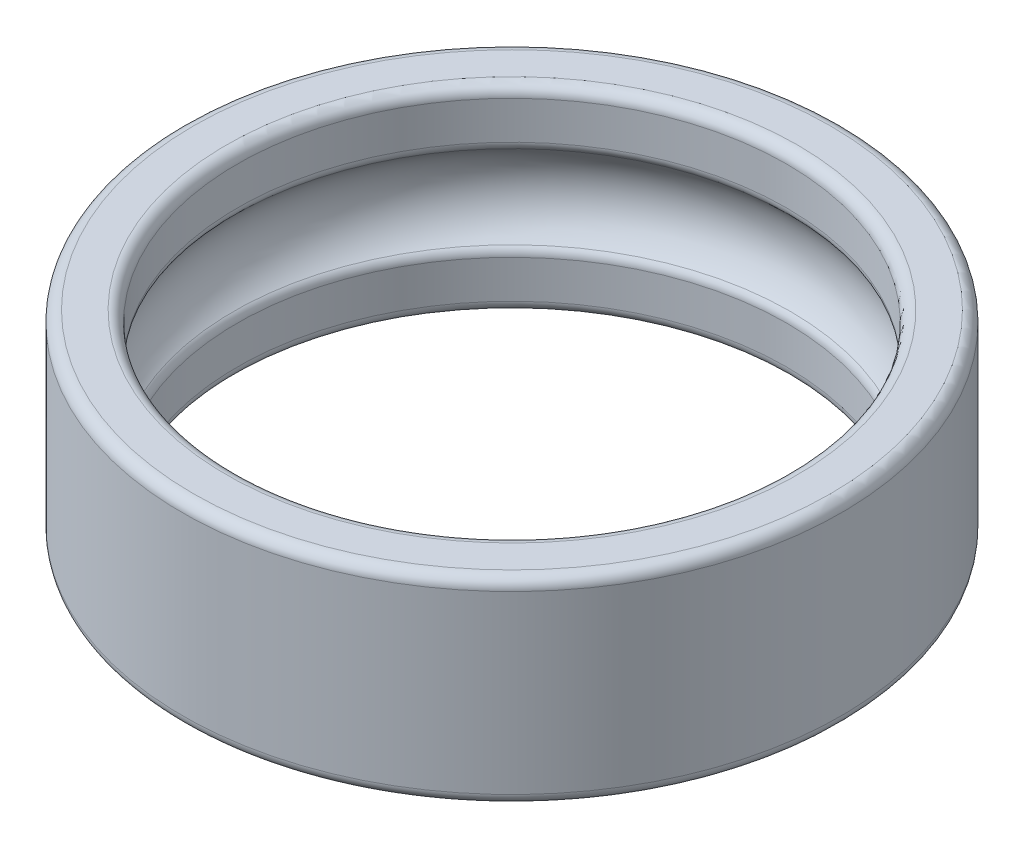
ISO-10303-21;
HEADER;
FILE_DESCRIPTION(('STEP AP214'),'2;1');
FILE_NAME('part.step','',(''),(''),'','','');
FILE_SCHEMA(('AUTOMOTIVE_DESIGN { 1 0 10303 214 1 1 1 1 }'));
ENDSEC;
DATA;
#1=APPLICATION_CONTEXT('core data for automotive mechanical design processes');
#2=APPLICATION_PROTOCOL_DEFINITION('international standard','automotive_design',2000,#1);
#3=PRODUCT_CONTEXT('',#1,'mechanical');
#4=PRODUCT('Part','Part','',(#3));
#5=PRODUCT_RELATED_PRODUCT_CATEGORY('part','',(#4));
#6=PRODUCT_DEFINITION_FORMATION('','',#4);
#7=PRODUCT_DEFINITION_CONTEXT('part definition',#1,'design');
#8=PRODUCT_DEFINITION('design','',#6,#7);
#9=PRODUCT_DEFINITION_SHAPE('','',#8);
#10=(LENGTH_UNIT() NAMED_UNIT(*) SI_UNIT(.MILLI.,.METRE.));
#11=(NAMED_UNIT(*) PLANE_ANGLE_UNIT() SI_UNIT($,.RADIAN.));
#12=(NAMED_UNIT(*) SI_UNIT($,.STERADIAN.) SOLID_ANGLE_UNIT());
#13=UNCERTAINTY_MEASURE_WITH_UNIT(LENGTH_MEASURE(1.E-05),#10,'distance_accuracy_value','');
#14=(GEOMETRIC_REPRESENTATION_CONTEXT(3) GLOBAL_UNCERTAINTY_ASSIGNED_CONTEXT((#13)) GLOBAL_UNIT_ASSIGNED_CONTEXT((#10,
#11,#12)) REPRESENTATION_CONTEXT('',''));
#15=CARTESIAN_POINT('',(0.,0.,0.));
#16=DIRECTION('',(0.,0.,1.));
#17=DIRECTION('',(1.,0.,0.));
#18=AXIS2_PLACEMENT_3D('',#15,#16,#17);
#19=CARTESIAN_POINT('',(0.,4.53899768671455,0.));
#20=DIRECTION('',(0.,-1.,0.));
#21=DIRECTION('',(0.,0.,-1.));
#22=AXIS2_PLACEMENT_3D('',#19,#20,#21);
#23=TOROIDAL_SURFACE('',#22,26.,1.);
#24=CARTESIAN_POINT('',(0.,3.78875013519148,0.));
#25=DIRECTION('',(0.,-1.,0.));
#26=DIRECTION('',(0.,0.,-1.));
#27=AXIS2_PLACEMENT_3D('',#24,#25,#26);
#28=CIRCLE('',#27,25.3388429752066);
#29=CARTESIAN_POINT('',(0.,3.78875013519148,-25.3388429752066));
#30=VERTEX_POINT('',#29);
#31=EDGE_CURVE('E74',#30,#30,#28,.T.);
#32=ORIENTED_EDGE('',*,*,#31,.T.);
#33=EDGE_LOOP('',(#32));
#34=FACE_BOUND('',#33,.T.);
#35=CARTESIAN_POINT('',(0.,4.53899768671455,0.));
#36=DIRECTION('',(0.,-1.,0.));
#37=DIRECTION('',(0.,0.,-1.));
#38=AXIS2_PLACEMENT_3D('',#35,#36,#37);
#39=CIRCLE('',#38,25.);
#40=CARTESIAN_POINT('',(0.,4.53899768671455,-25.));
#41=VERTEX_POINT('',#40);
#42=EDGE_CURVE('E10',#41,#41,#39,.T.);
#43=ORIENTED_EDGE('',*,*,#42,.F.);
#44=EDGE_LOOP('',(#43));
#45=FACE_BOUND('',#44,.T.);
#46=ADVANCED_FACE('F34',(#34,#45),#23,.T.);
#47=CARTESIAN_POINT('',(0.,0.,0.));
#48=DIRECTION('',(0.,-1.,0.));
#49=DIRECTION('',(0.,0.,-1.));
#50=AXIS2_PLACEMENT_3D('',#47,#48,#49);
#51=CYLINDRICAL_SURFACE('',#50,25.);
#52=ORIENTED_EDGE('',*,*,#42,.T.);
#53=EDGE_LOOP('',(#52));
#54=FACE_BOUND('',#53,.T.);
#55=CARTESIAN_POINT('',(0.,7.99999999999999,0.));
#56=DIRECTION('',(0.,-1.,0.));
#57=DIRECTION('',(0.,0.,-1.));
#58=AXIS2_PLACEMENT_3D('',#55,#56,#57);
#59=CIRCLE('',#58,25.);
#60=CARTESIAN_POINT('',(0.,7.99999999999999,-25.));
#61=VERTEX_POINT('',#60);
#62=EDGE_CURVE('E40',#61,#61,#59,.T.);
#63=ORIENTED_EDGE('',*,*,#62,.F.);
#64=EDGE_LOOP('',(#63));
#65=FACE_BOUND('',#64,.T.);
#66=ADVANCED_FACE('F92',(#54,#65),#51,.F.);
#67=CARTESIAN_POINT('',(0.,8.,0.));
#68=DIRECTION('',(0.,-1.,0.));
#69=DIRECTION('',(0.,0.,-1.));
#70=AXIS2_PLACEMENT_3D('',#67,#68,#69);
#71=TOROIDAL_SURFACE('',#70,26.,1.);
#72=ORIENTED_EDGE('',*,*,#62,.T.);
#73=EDGE_LOOP('',(#72));
#74=FACE_BOUND('',#73,.T.);
#75=CARTESIAN_POINT('',(0.,9.,0.));
#76=DIRECTION('',(0.,-1.,0.));
#77=DIRECTION('',(0.,0.,-1.));
#78=AXIS2_PLACEMENT_3D('',#75,#76,#77);
#79=CIRCLE('',#78,26.);
#80=CARTESIAN_POINT('',(0.,9.,-26.));
#81=VERTEX_POINT('',#80);
#82=EDGE_CURVE('E44',#81,#81,#79,.T.);
#83=ORIENTED_EDGE('',*,*,#82,.F.);
#84=EDGE_LOOP('',(#83));
#85=FACE_BOUND('',#84,.T.);
#86=ADVANCED_FACE('F96',(#74,#85),#71,.T.);
#87=CARTESIAN_POINT('',(0.,9.,-26.));
#88=DIRECTION('',(0.,1.,0.));
#89=DIRECTION('',(0.,0.,1.));
#90=AXIS2_PLACEMENT_3D('',#87,#88,#89);
#91=PLANE('',#90);
#92=ORIENTED_EDGE('',*,*,#82,.T.);
#93=EDGE_LOOP('',(#92));
#94=FACE_BOUND('',#93,.T.);
#95=CARTESIAN_POINT('',(0.,9.,0.));
#96=DIRECTION('',(0.,-1.,0.));
#97=DIRECTION('',(0.,0.,-1.));
#98=AXIS2_PLACEMENT_3D('',#95,#96,#97);
#99=CIRCLE('',#98,29.);
#100=CARTESIAN_POINT('',(0.,9.,-29.));
#101=VERTEX_POINT('',#100);
#102=EDGE_CURVE('E48',#101,#101,#99,.T.);
#103=ORIENTED_EDGE('',*,*,#102,.F.);
#104=EDGE_LOOP('',(#103));
#105=FACE_BOUND('',#104,.T.);
#106=ADVANCED_FACE('F100',(#94,#105),#91,.T.);
#107=CARTESIAN_POINT('',(0.,8.,0.));
#108=DIRECTION('',(0.,-1.,0.));
#109=DIRECTION('',(0.,0.,-1.));
#110=AXIS2_PLACEMENT_3D('',#107,#108,#109);
#111=TOROIDAL_SURFACE('',#110,29.,1.);
#112=ORIENTED_EDGE('',*,*,#102,.T.);
#113=EDGE_LOOP('',(#112));
#114=FACE_BOUND('',#113,.T.);
#115=CARTESIAN_POINT('',(0.,7.99999999999999,0.));
#116=DIRECTION('',(0.,-1.,0.));
#117=DIRECTION('',(0.,0.,-1.));
#118=AXIS2_PLACEMENT_3D('',#115,#116,#117);
#119=CIRCLE('',#118,30.);
#120=CARTESIAN_POINT('',(0.,7.99999999999999,-30.));
#121=VERTEX_POINT('',#120);
#122=EDGE_CURVE('E53',#121,#121,#119,.T.);
#123=ORIENTED_EDGE('',*,*,#122,.F.);
#124=EDGE_LOOP('',(#123));
#125=FACE_BOUND('',#124,.T.);
#126=ADVANCED_FACE('F106',(#114,#125),#111,.T.);
#127=CARTESIAN_POINT('',(0.,0.,0.));
#128=DIRECTION('',(0.,-1.,0.));
#129=DIRECTION('',(0.,0.,-1.));
#130=AXIS2_PLACEMENT_3D('',#127,#128,#129);
#131=CYLINDRICAL_SURFACE('',#130,30.);
#132=ORIENTED_EDGE('',*,*,#122,.T.);
#133=EDGE_LOOP('',(#132));
#134=FACE_BOUND('',#133,.T.);
#135=CARTESIAN_POINT('',(0.,-7.99999999999999,0.));
#136=DIRECTION('',(0.,-1.,0.));
#137=DIRECTION('',(0.,0.,-1.));
#138=AXIS2_PLACEMENT_3D('',#135,#136,#137);
#139=CIRCLE('',#138,30.);
#140=CARTESIAN_POINT('',(0.,-7.99999999999999,-30.));
#141=VERTEX_POINT('',#140);
#142=EDGE_CURVE('E56',#141,#141,#139,.T.);
#143=ORIENTED_EDGE('',*,*,#142,.F.);
#144=EDGE_LOOP('',(#143));
#145=FACE_BOUND('',#144,.T.);
#146=ADVANCED_FACE('F110',(#134,#145),#131,.T.);
#147=CARTESIAN_POINT('',(0.,-8.,0.));
#148=DIRECTION('',(0.,-1.,0.));
#149=DIRECTION('',(0.,0.,-1.));
#150=AXIS2_PLACEMENT_3D('',#147,#148,#149);
#151=TOROIDAL_SURFACE('',#150,29.,1.);
#152=ORIENTED_EDGE('',*,*,#142,.T.);
#153=EDGE_LOOP('',(#152));
#154=FACE_BOUND('',#153,.T.);
#155=CARTESIAN_POINT('',(0.,-9.,0.));
#156=DIRECTION('',(0.,-1.,0.));
#157=DIRECTION('',(0.,0.,-1.));
#158=AXIS2_PLACEMENT_3D('',#155,#156,#157);
#159=CIRCLE('',#158,29.);
#160=CARTESIAN_POINT('',(0.,-9.,-29.));
#161=VERTEX_POINT('',#160);
#162=EDGE_CURVE('E59',#161,#161,#159,.T.);
#163=ORIENTED_EDGE('',*,*,#162,.F.);
#164=EDGE_LOOP('',(#163));
#165=FACE_BOUND('',#164,.T.);
#166=ADVANCED_FACE('F114',(#154,#165),#151,.T.);
#167=CARTESIAN_POINT('',(0.,-9.,-29.));
#168=DIRECTION('',(0.,-1.,0.));
#169=DIRECTION('',(0.,0.,-1.));
#170=AXIS2_PLACEMENT_3D('',#167,#168,#169);
#171=PLANE('',#170);
#172=ORIENTED_EDGE('',*,*,#162,.T.);
#173=EDGE_LOOP('',(#172));
#174=FACE_BOUND('',#173,.T.);
#175=CARTESIAN_POINT('',(0.,-9.,0.));
#176=DIRECTION('',(0.,-1.,0.));
#177=DIRECTION('',(0.,0.,-1.));
#178=AXIS2_PLACEMENT_3D('',#175,#176,#177);
#179=CIRCLE('',#178,26.);
#180=CARTESIAN_POINT('',(0.,-9.,-26.));
#181=VERTEX_POINT('',#180);
#182=EDGE_CURVE('E62',#181,#181,#179,.T.);
#183=ORIENTED_EDGE('',*,*,#182,.F.);
#184=EDGE_LOOP('',(#183));
#185=FACE_BOUND('',#184,.T.);
#186=ADVANCED_FACE('F118',(#174,#185),#171,.T.);
#187=CARTESIAN_POINT('',(0.,-8.,0.));
#188=DIRECTION('',(0.,-1.,0.));
#189=DIRECTION('',(0.,0.,-1.));
#190=AXIS2_PLACEMENT_3D('',#187,#188,#189);
#191=TOROIDAL_SURFACE('',#190,26.,1.);
#192=ORIENTED_EDGE('',*,*,#182,.T.);
#193=EDGE_LOOP('',(#192));
#194=FACE_BOUND('',#193,.T.);
#195=CARTESIAN_POINT('',(0.,-7.99999999999999,0.));
#196=DIRECTION('',(0.,-1.,0.));
#197=DIRECTION('',(0.,0.,-1.));
#198=AXIS2_PLACEMENT_3D('',#195,#196,#197);
#199=CIRCLE('',#198,25.);
#200=CARTESIAN_POINT('',(0.,-7.99999999999999,-25.));
#201=VERTEX_POINT('',#200);
#202=EDGE_CURVE('E65',#201,#201,#199,.T.);
#203=ORIENTED_EDGE('',*,*,#202,.F.);
#204=EDGE_LOOP('',(#203));
#205=FACE_BOUND('',#204,.T.);
#206=ADVANCED_FACE('F122',(#194,#205),#191,.T.);
#207=CARTESIAN_POINT('',(0.,0.,0.));
#208=DIRECTION('',(0.,-1.,0.));
#209=DIRECTION('',(0.,0.,-1.));
#210=AXIS2_PLACEMENT_3D('',#207,#208,#209);
#211=CYLINDRICAL_SURFACE('',#210,25.);
#212=ORIENTED_EDGE('',*,*,#202,.T.);
#213=EDGE_LOOP('',(#212));
#214=FACE_BOUND('',#213,.T.);
#215=CARTESIAN_POINT('',(0.,-4.53899768671455,0.));
#216=DIRECTION('',(0.,-1.,0.));
#217=DIRECTION('',(0.,0.,-1.));
#218=AXIS2_PLACEMENT_3D('',#215,#216,#217);
#219=CIRCLE('',#218,25.);
#220=CARTESIAN_POINT('',(0.,-4.53899768671455,-25.));
#221=VERTEX_POINT('',#220);
#222=EDGE_CURVE('E68',#221,#221,#219,.T.);
#223=ORIENTED_EDGE('',*,*,#222,.F.);
#224=EDGE_LOOP('',(#223));
#225=FACE_BOUND('',#224,.T.);
#226=ADVANCED_FACE('F88',(#214,#225),#211,.F.);
#227=CARTESIAN_POINT('',(0.,-4.53899768671455,0.));
#228=DIRECTION('',(0.,-1.,0.));
#229=DIRECTION('',(0.,0.,-1.));
#230=AXIS2_PLACEMENT_3D('',#227,#228,#229);
#231=TOROIDAL_SURFACE('',#230,26.,1.);
#232=ORIENTED_EDGE('',*,*,#222,.T.);
#233=EDGE_LOOP('',(#232));
#234=FACE_BOUND('',#233,.T.);
#235=CARTESIAN_POINT('',(0.,-3.78875013519148,0.));
#236=DIRECTION('',(0.,-1.,0.));
#237=DIRECTION('',(0.,0.,-1.));
#238=AXIS2_PLACEMENT_3D('',#235,#236,#237);
#239=CIRCLE('',#238,25.3388429752066);
#240=CARTESIAN_POINT('',(0.,-3.78875013519148,-25.3388429752066));
#241=VERTEX_POINT('',#240);
#242=EDGE_CURVE('E71',#241,#241,#239,.T.);
#243=ORIENTED_EDGE('',*,*,#242,.F.);
#244=EDGE_LOOP('',(#243));
#245=FACE_BOUND('',#244,.T.);
#246=ADVANCED_FACE('F82',(#234,#245),#231,.T.);
#247=CARTESIAN_POINT('',(0.,0.,0.));
#248=DIRECTION('',(0.,-1.,0.));
#249=DIRECTION('',(0.,0.,-1.));
#250=AXIS2_PLACEMENT_3D('',#247,#248,#249);
#251=TOROIDAL_SURFACE('',#250,22.,5.05);
#252=ORIENTED_EDGE('',*,*,#242,.T.);
#253=EDGE_LOOP('',(#252));
#254=FACE_BOUND('',#253,.T.);
#255=ORIENTED_EDGE('',*,*,#31,.F.);
#256=EDGE_LOOP('',(#255));
#257=FACE_BOUND('',#256,.T.);
#258=ADVANCED_FACE('F80',(#254,#257),#251,.F.);
#259=CLOSED_SHELL('',(#46,#66,#86,#106,#126,#146,#166,#186,#206,#226,#246,#258));
#260=MANIFOLD_SOLID_BREP('B2',#259);
#261=ADVANCED_BREP_SHAPE_REPRESENTATION('',(#18,#260),#14);
#262=SHAPE_DEFINITION_REPRESENTATION(#9,#261);
ENDSEC;
END-ISO-10303-21;
